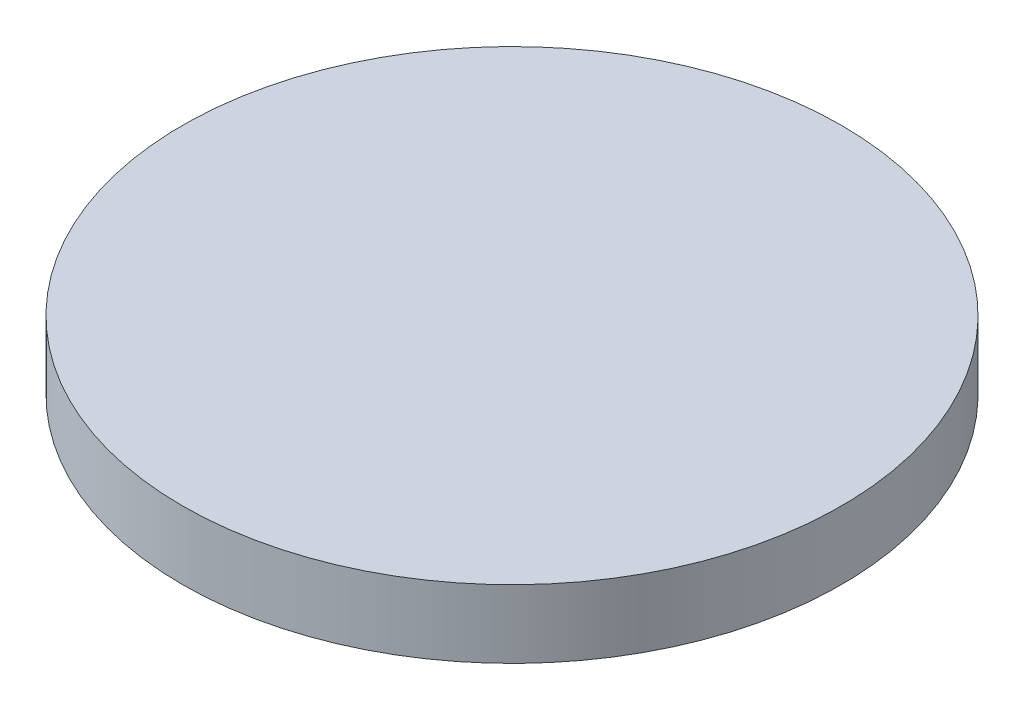
ISO-10303-21;
HEADER;
FILE_DESCRIPTION(('STEP AP214'),'2;1');
FILE_NAME('part.step','',(''),(''),'','','');
FILE_SCHEMA(('AUTOMOTIVE_DESIGN { 1 0 10303 214 1 1 1 1 }'));
ENDSEC;
DATA;
#1=APPLICATION_CONTEXT('core data for automotive mechanical design processes');
#2=APPLICATION_PROTOCOL_DEFINITION('international standard','automotive_design',2000,#1);
#3=PRODUCT_CONTEXT('',#1,'mechanical');
#4=PRODUCT('Part','Part','',(#3));
#5=PRODUCT_RELATED_PRODUCT_CATEGORY('part','',(#4));
#6=PRODUCT_DEFINITION_FORMATION('','',#4);
#7=PRODUCT_DEFINITION_CONTEXT('part definition',#1,'design');
#8=PRODUCT_DEFINITION('design','',#6,#7);
#9=PRODUCT_DEFINITION_SHAPE('','',#8);
#10=(LENGTH_UNIT() NAMED_UNIT(*) SI_UNIT(.MILLI.,.METRE.));
#11=(NAMED_UNIT(*) PLANE_ANGLE_UNIT() SI_UNIT($,.RADIAN.));
#12=(NAMED_UNIT(*) SI_UNIT($,.STERADIAN.) SOLID_ANGLE_UNIT());
#13=UNCERTAINTY_MEASURE_WITH_UNIT(LENGTH_MEASURE(1.E-05),#10,'distance_accuracy_value','');
#14=(GEOMETRIC_REPRESENTATION_CONTEXT(3) GLOBAL_UNCERTAINTY_ASSIGNED_CONTEXT((#13)) GLOBAL_UNIT_ASSIGNED_CONTEXT((#10,
#11,#12)) REPRESENTATION_CONTEXT('',''));
#15=CARTESIAN_POINT('',(0.,0.,0.));
#16=DIRECTION('',(0.,0.,1.));
#17=DIRECTION('',(1.,0.,0.));
#18=AXIS2_PLACEMENT_3D('',#15,#16,#17);
#19=CARTESIAN_POINT('',(0.,30.,0.));
#20=DIRECTION('',(0.,-1.,0.));
#21=DIRECTION('',(0.,0.,-1.));
#22=AXIS2_PLACEMENT_3D('',#19,#20,#21);
#23=CYLINDRICAL_SURFACE('',#22,145.);
#24=CARTESIAN_POINT('',(0.,30.,0.));
#25=DIRECTION('',(0.,1.,0.));
#26=DIRECTION('',(0.,0.,1.));
#27=AXIS2_PLACEMENT_3D('',#24,#25,#26);
#28=CIRCLE('',#27,145.);
#29=CARTESIAN_POINT('',(0.,30.,145.));
#30=VERTEX_POINT('',#29);
#31=EDGE_CURVE('E10',#30,#30,#28,.T.);
#32=ORIENTED_EDGE('',*,*,#31,.F.);
#33=EDGE_LOOP('',(#32));
#34=FACE_BOUND('',#33,.T.);
#35=CARTESIAN_POINT('',(0.,0.,0.));
#36=DIRECTION('',(0.,1.,0.));
#37=DIRECTION('',(0.,0.,1.));
#38=AXIS2_PLACEMENT_3D('',#35,#36,#37);
#39=CIRCLE('',#38,145.);
#40=CARTESIAN_POINT('',(0.,0.,145.));
#41=VERTEX_POINT('',#40);
#42=EDGE_CURVE('E35',#41,#41,#39,.T.);
#43=ORIENTED_EDGE('',*,*,#42,.T.);
#44=EDGE_LOOP('',(#43));
#45=FACE_BOUND('',#44,.T.);
#46=ADVANCED_FACE('F32',(#34,#45),#23,.T.);
#47=CARTESIAN_POINT('',(0.,30.,0.));
#48=DIRECTION('',(0.,1.,0.));
#49=DIRECTION('',(0.,0.,1.));
#50=AXIS2_PLACEMENT_3D('',#47,#48,#49);
#51=PLANE('',#50);
#52=ORIENTED_EDGE('',*,*,#31,.T.);
#53=EDGE_LOOP('',(#52));
#54=FACE_BOUND('',#53,.T.);
#55=ADVANCED_FACE('F47',(#54),#51,.T.);
#56=CARTESIAN_POINT('',(0.,0.,0.));
#57=DIRECTION('',(0.,1.,0.));
#58=DIRECTION('',(0.,0.,1.));
#59=AXIS2_PLACEMENT_3D('',#56,#57,#58);
#60=PLANE('',#59);
#61=ORIENTED_EDGE('',*,*,#42,.F.);
#62=EDGE_LOOP('',(#61));
#63=FACE_BOUND('',#62,.T.);
#64=ADVANCED_FACE('F45',(#63),#60,.F.);
#65=CLOSED_SHELL('',(#46,#55,#64));
#66=MANIFOLD_SOLID_BREP('B2',#65);
#67=ADVANCED_BREP_SHAPE_REPRESENTATION('',(#18,#66),#14);
#68=SHAPE_DEFINITION_REPRESENTATION(#9,#67);
ENDSEC;
END-ISO-10303-21;
